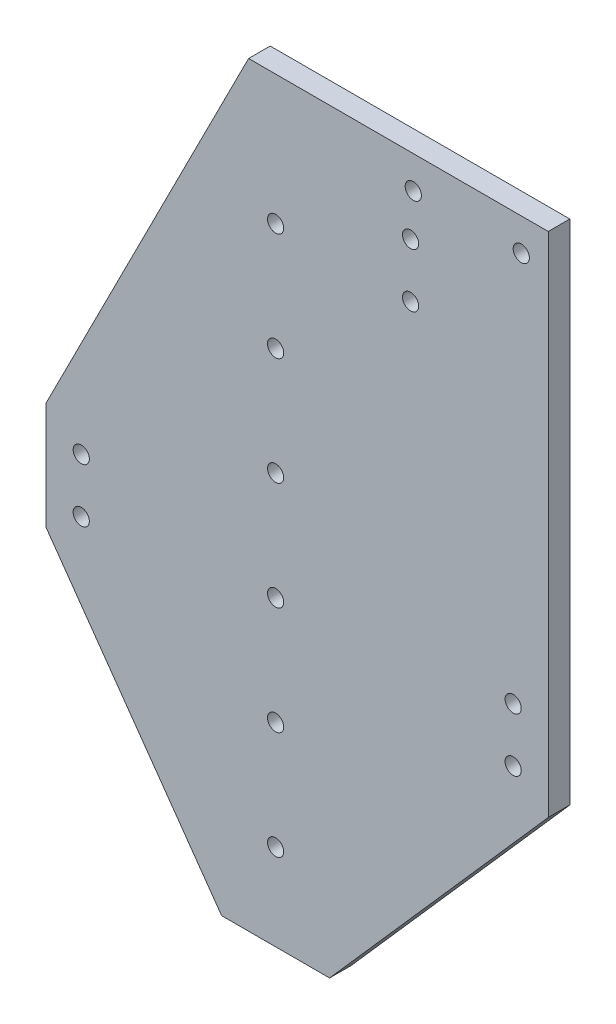
ISO-10303-21;
HEADER;
FILE_DESCRIPTION(('STEP AP214'),'2;1');
FILE_NAME('part.step','',(''),(''),'','','');
FILE_SCHEMA(('AUTOMOTIVE_DESIGN { 1 0 10303 214 1 1 1 1 }'));
ENDSEC;
DATA;
#1=APPLICATION_CONTEXT('core data for automotive mechanical design processes');
#2=APPLICATION_PROTOCOL_DEFINITION('international standard','automotive_design',2000,#1);
#3=PRODUCT_CONTEXT('',#1,'mechanical');
#4=PRODUCT('Part','Part','',(#3));
#5=PRODUCT_RELATED_PRODUCT_CATEGORY('part','',(#4));
#6=PRODUCT_DEFINITION_FORMATION('','',#4);
#7=PRODUCT_DEFINITION_CONTEXT('part definition',#1,'design');
#8=PRODUCT_DEFINITION('design','',#6,#7);
#9=PRODUCT_DEFINITION_SHAPE('','',#8);
#10=(LENGTH_UNIT() NAMED_UNIT(*) SI_UNIT(.MILLI.,.METRE.));
#11=(NAMED_UNIT(*) PLANE_ANGLE_UNIT() SI_UNIT($,.RADIAN.));
#12=(NAMED_UNIT(*) SI_UNIT($,.STERADIAN.) SOLID_ANGLE_UNIT());
#13=UNCERTAINTY_MEASURE_WITH_UNIT(LENGTH_MEASURE(1.E-05),#10,'distance_accuracy_value','');
#14=(GEOMETRIC_REPRESENTATION_CONTEXT(3) GLOBAL_UNCERTAINTY_ASSIGNED_CONTEXT((#13)) GLOBAL_UNIT_ASSIGNED_CONTEXT((#10,
#11,#12)) REPRESENTATION_CONTEXT('',''));
#15=CARTESIAN_POINT('',(0.,0.,0.));
#16=DIRECTION('',(0.,0.,1.));
#17=DIRECTION('',(1.,0.,0.));
#18=AXIS2_PLACEMENT_3D('',#15,#16,#17);
#19=CARTESIAN_POINT('',(0.,0.,4.));
#20=DIRECTION('',(0.,0.,-1.));
#21=DIRECTION('',(-1.,0.,0.));
#22=AXIS2_PLACEMENT_3D('',#19,#20,#21);
#23=PLANE('',#22);
#24=DIRECTION('',(0.660811783322883,0.750551655132164,0.));
#25=VECTOR('',#24,1.);
#26=CARTESIAN_POINT('',(-40.5,-46.,4.));
#27=LINE('',#26,#25);
#28=CARTESIAN_POINT('',(-40.5,-46.,4.));
#29=VERTEX_POINT('',#28);
#30=CARTESIAN_POINT('',(0.,0.,4.));
#31=VERTEX_POINT('',#30);
#32=EDGE_CURVE('E143',#29,#31,#27,.T.);
#33=ORIENTED_EDGE('',*,*,#32,.T.);
#34=DIRECTION('',(0.,1.,0.));
#35=VECTOR('',#34,1.);
#36=CARTESIAN_POINT('',(0.,0.,4.));
#37=LINE('',#36,#35);
#38=CARTESIAN_POINT('',(0.,94.,4.));
#39=VERTEX_POINT('',#38);
#40=EDGE_CURVE('E96',#31,#39,#37,.T.);
#41=ORIENTED_EDGE('',*,*,#40,.T.);
#42=DIRECTION('',(-1.,0.,0.));
#43=VECTOR('',#42,1.);
#44=CARTESIAN_POINT('',(-55.5,94.,4.));
#45=LINE('',#44,#43);
#46=CARTESIAN_POINT('',(-55.5,94.,4.));
#47=VERTEX_POINT('',#46);
#48=EDGE_CURVE('E157',#39,#47,#45,.T.);
#49=ORIENTED_EDGE('',*,*,#48,.T.);
#50=DIRECTION('',(-0.452028737244174,-0.892003374828502,0.));
#51=VECTOR('',#50,1.);
#52=CARTESIAN_POINT('',(-93.,20.,4.));
#53=LINE('',#52,#51);
#54=CARTESIAN_POINT('',(-93.,20.,4.));
#55=VERTEX_POINT('',#54);
#56=EDGE_CURVE('E112',#47,#55,#53,.T.);
#57=ORIENTED_EDGE('',*,*,#56,.T.);
#58=DIRECTION('',(0.,-1.,0.));
#59=VECTOR('',#58,1.);
#60=CARTESIAN_POINT('',(-93.,0.,4.));
#61=LINE('',#60,#59);
#62=CARTESIAN_POINT('',(-93.,0.,4.));
#63=VERTEX_POINT('',#62);
#64=EDGE_CURVE('E108',#55,#63,#61,.T.);
#65=ORIENTED_EDGE('',*,*,#64,.T.);
#66=DIRECTION('',(0.577031680864998,-0.816721763685844,0.));
#67=VECTOR('',#66,1.);
#68=CARTESIAN_POINT('',(-93.,0.,4.));
#69=LINE('',#68,#67);
#70=CARTESIAN_POINT('',(-60.5,-46.,4.));
#71=VERTEX_POINT('',#70);
#72=EDGE_CURVE('E115',#63,#71,#69,.T.);
#73=ORIENTED_EDGE('',*,*,#72,.T.);
#74=DIRECTION('',(1.,0.,0.));
#75=VECTOR('',#74,1.);
#76=CARTESIAN_POINT('',(-60.5,-46.,4.));
#77=LINE('',#76,#75);
#78=EDGE_CURVE('E59',#71,#29,#77,.T.);
#79=ORIENTED_EDGE('',*,*,#78,.T.);
#80=EDGE_LOOP('',(#33,#41,#49,#57,#65,#73,#79));
#81=FACE_BOUND('',#80,.T.);
#82=CARTESIAN_POINT('',(-86.5,15.,4.));
#83=DIRECTION('',(0.,0.,1.));
#84=DIRECTION('',(1.,0.,0.));
#85=AXIS2_PLACEMENT_3D('',#82,#83,#84);
#86=CIRCLE('',#85,1.5);
#87=CARTESIAN_POINT('',(-85.,15.,4.));
#88=VERTEX_POINT('',#87);
#89=EDGE_CURVE('E136',#88,#88,#86,.T.);
#90=ORIENTED_EDGE('',*,*,#89,.F.);
#91=EDGE_LOOP('',(#90));
#92=FACE_BOUND('',#91,.T.);
#93=CARTESIAN_POINT('',(-86.5,5.00000000000003,4.));
#94=DIRECTION('',(0.,0.,1.));
#95=DIRECTION('',(-1.,0.,0.));
#96=AXIS2_PLACEMENT_3D('',#93,#94,#95);
#97=CIRCLE('',#96,1.5);
#98=CARTESIAN_POINT('',(-88.,5.00000000000003,4.));
#99=VERTEX_POINT('',#98);
#100=EDGE_CURVE('E175',#99,#99,#97,.T.);
#101=ORIENTED_EDGE('',*,*,#100,.F.);
#102=EDGE_LOOP('',(#101));
#103=FACE_BOUND('',#102,.T.);
#104=CARTESIAN_POINT('',(-6.50000000000001,5.00000000000003,4.));
#105=DIRECTION('',(0.,0.,1.));
#106=DIRECTION('',(1.,0.,0.));
#107=AXIS2_PLACEMENT_3D('',#104,#105,#106);
#108=CIRCLE('',#107,1.5);
#109=CARTESIAN_POINT('',(-5.,5.00000000000003,4.));
#110=VERTEX_POINT('',#109);
#111=EDGE_CURVE('E178',#110,#110,#108,.T.);
#112=ORIENTED_EDGE('',*,*,#111,.F.);
#113=EDGE_LOOP('',(#112));
#114=FACE_BOUND('',#113,.T.);
#115=CARTESIAN_POINT('',(-6.50000000000001,15.,4.));
#116=DIRECTION('',(0.,0.,1.));
#117=DIRECTION('',(-1.,0.,0.));
#118=AXIS2_PLACEMENT_3D('',#115,#116,#117);
#119=CIRCLE('',#118,1.5);
#120=CARTESIAN_POINT('',(-8.00000000000001,15.,4.));
#121=VERTEX_POINT('',#120);
#122=EDGE_CURVE('E183',#121,#121,#119,.T.);
#123=ORIENTED_EDGE('',*,*,#122,.F.);
#124=EDGE_LOOP('',(#123));
#125=FACE_BOUND('',#124,.T.);
#126=CARTESIAN_POINT('',(-25.5,80.,4.));
#127=DIRECTION('',(0.,0.,1.));
#128=DIRECTION('',(1.,0.,0.));
#129=AXIS2_PLACEMENT_3D('',#126,#127,#128);
#130=CIRCLE('',#129,1.5);
#131=CARTESIAN_POINT('',(-24.,80.,4.));
#132=VERTEX_POINT('',#131);
#133=EDGE_CURVE('E188',#132,#132,#130,.T.);
#134=ORIENTED_EDGE('',*,*,#133,.F.);
#135=EDGE_LOOP('',(#134));
#136=FACE_BOUND('',#135,.T.);
#137=CARTESIAN_POINT('',(-25.4999999999999,70.,4.));
#138=DIRECTION('',(0.,0.,1.));
#139=DIRECTION('',(1.,0.,0.));
#140=AXIS2_PLACEMENT_3D('',#137,#138,#139);
#141=CIRCLE('',#140,1.5);
#142=CARTESIAN_POINT('',(-23.9999999999999,70.,4.));
#143=VERTEX_POINT('',#142);
#144=EDGE_CURVE('E197',#143,#143,#141,.T.);
#145=ORIENTED_EDGE('',*,*,#144,.F.);
#146=EDGE_LOOP('',(#145));
#147=FACE_BOUND('',#146,.T.);
#148=CARTESIAN_POINT('',(-50.5,10.,4.));
#149=DIRECTION('',(0.,0.,1.));
#150=DIRECTION('',(1.,0.,0.));
#151=AXIS2_PLACEMENT_3D('',#148,#149,#150);
#152=CIRCLE('',#151,1.5);
#153=CARTESIAN_POINT('',(-49.,10.,4.));
#154=VERTEX_POINT('',#153);
#155=EDGE_CURVE('E202',#154,#154,#152,.T.);
#156=ORIENTED_EDGE('',*,*,#155,.F.);
#157=EDGE_LOOP('',(#156));
#158=FACE_BOUND('',#157,.T.);
#159=CARTESIAN_POINT('',(-50.5000000000001,30.,4.));
#160=DIRECTION('',(0.,0.,1.));
#161=DIRECTION('',(1.,0.,0.));
#162=AXIS2_PLACEMENT_3D('',#159,#160,#161);
#163=CIRCLE('',#162,1.5);
#164=CARTESIAN_POINT('',(-49.0000000000001,30.,4.));
#165=VERTEX_POINT('',#164);
#166=EDGE_CURVE('E206',#165,#165,#163,.T.);
#167=ORIENTED_EDGE('',*,*,#166,.F.);
#168=EDGE_LOOP('',(#167));
#169=FACE_BOUND('',#168,.T.);
#170=CARTESIAN_POINT('',(-50.5000000000001,50.,4.));
#171=DIRECTION('',(0.,0.,1.));
#172=DIRECTION('',(1.,0.,0.));
#173=AXIS2_PLACEMENT_3D('',#170,#171,#172);
#174=CIRCLE('',#173,1.5);
#175=CARTESIAN_POINT('',(-49.0000000000001,50.,4.));
#176=VERTEX_POINT('',#175);
#177=EDGE_CURVE('E211',#176,#176,#174,.T.);
#178=ORIENTED_EDGE('',*,*,#177,.F.);
#179=EDGE_LOOP('',(#178));
#180=FACE_BOUND('',#179,.T.);
#181=CARTESIAN_POINT('',(-50.4999999999998,-10.,4.));
#182=DIRECTION('',(0.,0.,1.));
#183=DIRECTION('',(1.,0.,0.));
#184=AXIS2_PLACEMENT_3D('',#181,#182,#183);
#185=CIRCLE('',#184,1.5);
#186=CARTESIAN_POINT('',(-48.9999999999998,-10.,4.));
#187=VERTEX_POINT('',#186);
#188=EDGE_CURVE('E218',#187,#187,#185,.T.);
#189=ORIENTED_EDGE('',*,*,#188,.F.);
#190=EDGE_LOOP('',(#189));
#191=FACE_BOUND('',#190,.T.);
#192=CARTESIAN_POINT('',(-50.4999999999996,-30.,4.));
#193=DIRECTION('',(0.,0.,1.));
#194=DIRECTION('',(1.,0.,0.));
#195=AXIS2_PLACEMENT_3D('',#192,#193,#194);
#196=CIRCLE('',#195,1.5);
#197=CARTESIAN_POINT('',(-48.9999999999996,-30.,4.));
#198=VERTEX_POINT('',#197);
#199=EDGE_CURVE('E228',#198,#198,#196,.T.);
#200=ORIENTED_EDGE('',*,*,#199,.F.);
#201=EDGE_LOOP('',(#200));
#202=FACE_BOUND('',#201,.T.);
#203=CARTESIAN_POINT('',(-5.,88.,4.));
#204=DIRECTION('',(0.,0.,1.));
#205=DIRECTION('',(1.,0.,0.));
#206=AXIS2_PLACEMENT_3D('',#203,#204,#205);
#207=CIRCLE('',#206,1.5);
#208=CARTESIAN_POINT('',(-3.5,88.,4.));
#209=VERTEX_POINT('',#208);
#210=EDGE_CURVE('E235',#209,#209,#207,.T.);
#211=ORIENTED_EDGE('',*,*,#210,.F.);
#212=EDGE_LOOP('',(#211));
#213=FACE_BOUND('',#212,.T.);
#214=CARTESIAN_POINT('',(-25.,88.,4.));
#215=DIRECTION('',(0.,0.,1.));
#216=DIRECTION('',(1.,0.,0.));
#217=AXIS2_PLACEMENT_3D('',#214,#215,#216);
#218=CIRCLE('',#217,1.5);
#219=CARTESIAN_POINT('',(-23.5,88.,4.));
#220=VERTEX_POINT('',#219);
#221=EDGE_CURVE('E238',#220,#220,#218,.T.);
#222=ORIENTED_EDGE('',*,*,#221,.F.);
#223=EDGE_LOOP('',(#222));
#224=FACE_BOUND('',#223,.T.);
#225=CARTESIAN_POINT('',(-50.5000000000002,70.,4.));
#226=DIRECTION('',(0.,0.,1.));
#227=DIRECTION('',(1.,0.,0.));
#228=AXIS2_PLACEMENT_3D('',#225,#226,#227);
#229=CIRCLE('',#228,1.49999999999999);
#230=CARTESIAN_POINT('',(-49.0000000000002,70.,4.));
#231=VERTEX_POINT('',#230);
#232=EDGE_CURVE('E242',#231,#231,#229,.T.);
#233=ORIENTED_EDGE('',*,*,#232,.F.);
#234=EDGE_LOOP('',(#233));
#235=FACE_BOUND('',#234,.T.);
#236=ADVANCED_FACE('F41',(#81,#92,#103,#114,#125,#136,#147,#158,#169,#180,#191,#202,#213,#224,
#235),#23,.F.);
#237=CARTESIAN_POINT('',(0.,0.,0.));
#238=DIRECTION('',(0.,0.,-1.));
#239=DIRECTION('',(-1.,0.,0.));
#240=AXIS2_PLACEMENT_3D('',#237,#238,#239);
#241=PLANE('',#240);
#242=CARTESIAN_POINT('',(-25.,88.,0.));
#243=DIRECTION('',(0.,0.,1.));
#244=DIRECTION('',(1.,0.,0.));
#245=AXIS2_PLACEMENT_3D('',#242,#243,#244);
#246=CIRCLE('',#245,1.5);
#247=CARTESIAN_POINT('',(-23.5,88.,0.));
#248=VERTEX_POINT('',#247);
#249=EDGE_CURVE('E241',#248,#248,#246,.T.);
#250=ORIENTED_EDGE('',*,*,#249,.T.);
#251=EDGE_LOOP('',(#250));
#252=FACE_BOUND('',#251,.T.);
#253=CARTESIAN_POINT('',(-50.4999999999996,-30.,0.));
#254=DIRECTION('',(0.,0.,1.));
#255=DIRECTION('',(1.,0.,0.));
#256=AXIS2_PLACEMENT_3D('',#253,#254,#255);
#257=CIRCLE('',#256,1.5);
#258=CARTESIAN_POINT('',(-48.9999999999996,-30.,0.));
#259=VERTEX_POINT('',#258);
#260=EDGE_CURVE('E230',#259,#259,#257,.T.);
#261=ORIENTED_EDGE('',*,*,#260,.T.);
#262=EDGE_LOOP('',(#261));
#263=FACE_BOUND('',#262,.T.);
#264=CARTESIAN_POINT('',(-50.5000000000001,50.,0.));
#265=DIRECTION('',(0.,0.,1.));
#266=DIRECTION('',(1.,0.,0.));
#267=AXIS2_PLACEMENT_3D('',#264,#265,#266);
#268=CIRCLE('',#267,1.5);
#269=CARTESIAN_POINT('',(-49.0000000000001,50.,0.));
#270=VERTEX_POINT('',#269);
#271=EDGE_CURVE('E220',#270,#270,#268,.T.);
#272=ORIENTED_EDGE('',*,*,#271,.T.);
#273=EDGE_LOOP('',(#272));
#274=FACE_BOUND('',#273,.T.);
#275=CARTESIAN_POINT('',(-50.5,10.,0.));
#276=DIRECTION('',(0.,0.,1.));
#277=DIRECTION('',(1.,0.,0.));
#278=AXIS2_PLACEMENT_3D('',#275,#276,#277);
#279=CIRCLE('',#278,1.5);
#280=CARTESIAN_POINT('',(-49.,10.,0.));
#281=VERTEX_POINT('',#280);
#282=EDGE_CURVE('E205',#281,#281,#279,.T.);
#283=ORIENTED_EDGE('',*,*,#282,.T.);
#284=EDGE_LOOP('',(#283));
#285=FACE_BOUND('',#284,.T.);
#286=CARTESIAN_POINT('',(-25.5,80.,0.));
#287=DIRECTION('',(0.,0.,1.));
#288=DIRECTION('',(1.,0.,0.));
#289=AXIS2_PLACEMENT_3D('',#286,#287,#288);
#290=CIRCLE('',#289,1.5);
#291=CARTESIAN_POINT('',(-24.,80.,0.));
#292=VERTEX_POINT('',#291);
#293=EDGE_CURVE('E194',#292,#292,#290,.T.);
#294=ORIENTED_EDGE('',*,*,#293,.T.);
#295=EDGE_LOOP('',(#294));
#296=FACE_BOUND('',#295,.T.);
#297=CARTESIAN_POINT('',(-6.50000000000001,5.00000000000003,0.));
#298=DIRECTION('',(0.,0.,1.));
#299=DIRECTION('',(1.,0.,0.));
#300=AXIS2_PLACEMENT_3D('',#297,#298,#299);
#301=CIRCLE('',#300,1.5);
#302=CARTESIAN_POINT('',(-5.,5.00000000000003,0.));
#303=VERTEX_POINT('',#302);
#304=EDGE_CURVE('E181',#303,#303,#301,.T.);
#305=ORIENTED_EDGE('',*,*,#304,.T.);
#306=EDGE_LOOP('',(#305));
#307=FACE_BOUND('',#306,.T.);
#308=CARTESIAN_POINT('',(-86.5,15.,0.));
#309=DIRECTION('',(0.,0.,1.));
#310=DIRECTION('',(1.,0.,0.));
#311=AXIS2_PLACEMENT_3D('',#308,#309,#310);
#312=CIRCLE('',#311,1.5);
#313=CARTESIAN_POINT('',(-85.,15.,0.));
#314=VERTEX_POINT('',#313);
#315=EDGE_CURVE('E169',#314,#314,#312,.T.);
#316=ORIENTED_EDGE('',*,*,#315,.T.);
#317=EDGE_LOOP('',(#316));
#318=FACE_BOUND('',#317,.T.);
#319=DIRECTION('',(0.660811783322883,0.750551655132164,0.));
#320=VECTOR('',#319,1.);
#321=CARTESIAN_POINT('',(-40.5,-46.,0.));
#322=LINE('',#321,#320);
#323=CARTESIAN_POINT('',(-40.5,-46.,0.));
#324=VERTEX_POINT('',#323);
#325=CARTESIAN_POINT('',(0.,0.,0.));
#326=VERTEX_POINT('',#325);
#327=EDGE_CURVE('E135',#324,#326,#322,.T.);
#328=ORIENTED_EDGE('',*,*,#327,.F.);
#329=DIRECTION('',(1.,0.,0.));
#330=VECTOR('',#329,1.);
#331=CARTESIAN_POINT('',(-60.5,-46.,0.));
#332=LINE('',#331,#330);
#333=CARTESIAN_POINT('',(-60.5,-46.,0.));
#334=VERTEX_POINT('',#333);
#335=EDGE_CURVE('E88',#334,#324,#332,.T.);
#336=ORIENTED_EDGE('',*,*,#335,.F.);
#337=DIRECTION('',(0.577031680864998,-0.816721763685844,0.));
#338=VECTOR('',#337,1.);
#339=CARTESIAN_POINT('',(-93.,0.,0.));
#340=LINE('',#339,#338);
#341=CARTESIAN_POINT('',(-93.,0.,0.));
#342=VERTEX_POINT('',#341);
#343=EDGE_CURVE('E81',#342,#334,#340,.T.);
#344=ORIENTED_EDGE('',*,*,#343,.F.);
#345=DIRECTION('',(0.,-1.,0.));
#346=VECTOR('',#345,1.);
#347=CARTESIAN_POINT('',(-93.,0.,0.));
#348=LINE('',#347,#346);
#349=CARTESIAN_POINT('',(-93.,20.,0.));
#350=VERTEX_POINT('',#349);
#351=EDGE_CURVE('E125',#350,#342,#348,.T.);
#352=ORIENTED_EDGE('',*,*,#351,.F.);
#353=DIRECTION('',(-0.452028737244174,-0.892003374828502,0.));
#354=VECTOR('',#353,1.);
#355=CARTESIAN_POINT('',(-93.,20.,0.));
#356=LINE('',#355,#354);
#357=CARTESIAN_POINT('',(-55.5,94.,0.));
#358=VERTEX_POINT('',#357);
#359=EDGE_CURVE('E140',#358,#350,#356,.T.);
#360=ORIENTED_EDGE('',*,*,#359,.F.);
#361=DIRECTION('',(-1.,0.,0.));
#362=VECTOR('',#361,1.);
#363=CARTESIAN_POINT('',(-55.5,94.,0.));
#364=LINE('',#363,#362);
#365=CARTESIAN_POINT('',(0.,94.,0.));
#366=VERTEX_POINT('',#365);
#367=EDGE_CURVE('E139',#366,#358,#364,.T.);
#368=ORIENTED_EDGE('',*,*,#367,.F.);
#369=DIRECTION('',(0.,1.,0.));
#370=VECTOR('',#369,1.);
#371=CARTESIAN_POINT('',(0.,0.,0.));
#372=LINE('',#371,#370);
#373=EDGE_CURVE('E133',#326,#366,#372,.T.);
#374=ORIENTED_EDGE('',*,*,#373,.F.);
#375=EDGE_LOOP('',(#328,#336,#344,#352,#360,#368,#374));
#376=FACE_BOUND('',#375,.T.);
#377=CARTESIAN_POINT('',(-86.5,5.00000000000003,0.));
#378=DIRECTION('',(0.,0.,1.));
#379=DIRECTION('',(-1.,0.,0.));
#380=AXIS2_PLACEMENT_3D('',#377,#378,#379);
#381=CIRCLE('',#380,1.5);
#382=CARTESIAN_POINT('',(-88.,5.00000000000003,0.));
#383=VERTEX_POINT('',#382);
#384=EDGE_CURVE('E174',#383,#383,#381,.T.);
#385=ORIENTED_EDGE('',*,*,#384,.T.);
#386=EDGE_LOOP('',(#385));
#387=FACE_BOUND('',#386,.T.);
#388=CARTESIAN_POINT('',(-6.50000000000001,15.,0.));
#389=DIRECTION('',(0.,0.,1.));
#390=DIRECTION('',(-1.,0.,0.));
#391=AXIS2_PLACEMENT_3D('',#388,#389,#390);
#392=CIRCLE('',#391,1.5);
#393=CARTESIAN_POINT('',(-8.00000000000001,15.,0.));
#394=VERTEX_POINT('',#393);
#395=EDGE_CURVE('E190',#394,#394,#392,.T.);
#396=ORIENTED_EDGE('',*,*,#395,.T.);
#397=EDGE_LOOP('',(#396));
#398=FACE_BOUND('',#397,.T.);
#399=CARTESIAN_POINT('',(-25.4999999999999,70.,0.));
#400=DIRECTION('',(0.,0.,1.));
#401=DIRECTION('',(1.,0.,0.));
#402=AXIS2_PLACEMENT_3D('',#399,#400,#401);
#403=CIRCLE('',#402,1.5);
#404=CARTESIAN_POINT('',(-23.9999999999999,70.,0.));
#405=VERTEX_POINT('',#404);
#406=EDGE_CURVE('E196',#405,#405,#403,.T.);
#407=ORIENTED_EDGE('',*,*,#406,.T.);
#408=EDGE_LOOP('',(#407));
#409=FACE_BOUND('',#408,.T.);
#410=CARTESIAN_POINT('',(-50.5000000000001,30.,0.));
#411=DIRECTION('',(0.,0.,1.));
#412=DIRECTION('',(1.,0.,0.));
#413=AXIS2_PLACEMENT_3D('',#410,#411,#412);
#414=CIRCLE('',#413,1.5);
#415=CARTESIAN_POINT('',(-49.0000000000001,30.,0.));
#416=VERTEX_POINT('',#415);
#417=EDGE_CURVE('E212',#416,#416,#414,.T.);
#418=ORIENTED_EDGE('',*,*,#417,.T.);
#419=EDGE_LOOP('',(#418));
#420=FACE_BOUND('',#419,.T.);
#421=CARTESIAN_POINT('',(-50.4999999999998,-10.,0.));
#422=DIRECTION('',(0.,0.,1.));
#423=DIRECTION('',(1.,0.,0.));
#424=AXIS2_PLACEMENT_3D('',#421,#422,#423);
#425=CIRCLE('',#424,1.5);
#426=CARTESIAN_POINT('',(-48.9999999999998,-10.,0.));
#427=VERTEX_POINT('',#426);
#428=EDGE_CURVE('E224',#427,#427,#425,.T.);
#429=ORIENTED_EDGE('',*,*,#428,.T.);
#430=EDGE_LOOP('',(#429));
#431=FACE_BOUND('',#430,.T.);
#432=CARTESIAN_POINT('',(-5.,88.,0.));
#433=DIRECTION('',(0.,0.,1.));
#434=DIRECTION('',(1.,0.,0.));
#435=AXIS2_PLACEMENT_3D('',#432,#433,#434);
#436=CIRCLE('',#435,1.5);
#437=CARTESIAN_POINT('',(-3.5,88.,0.));
#438=VERTEX_POINT('',#437);
#439=EDGE_CURVE('E232',#438,#438,#436,.T.);
#440=ORIENTED_EDGE('',*,*,#439,.T.);
#441=EDGE_LOOP('',(#440));
#442=FACE_BOUND('',#441,.T.);
#443=CARTESIAN_POINT('',(-50.5000000000002,70.,0.));
#444=DIRECTION('',(0.,0.,1.));
#445=DIRECTION('',(1.,0.,0.));
#446=AXIS2_PLACEMENT_3D('',#443,#444,#445);
#447=CIRCLE('',#446,1.49999999999999);
#448=CARTESIAN_POINT('',(-49.0000000000002,70.,0.));
#449=VERTEX_POINT('',#448);
#450=EDGE_CURVE('E250',#449,#449,#447,.T.);
#451=ORIENTED_EDGE('',*,*,#450,.T.);
#452=EDGE_LOOP('',(#451));
#453=FACE_BOUND('',#452,.T.);
#454=ADVANCED_FACE('F163',(#252,#263,#274,#285,#296,#307,#318,#376,#387,#398,#409,#420,#431,
#442,#453),#241,.T.);
#455=CARTESIAN_POINT('',(-40.5,-46.,4.));
#456=DIRECTION('',(-0.750551655132164,0.660811783322883,0.));
#457=DIRECTION('',(-0.660811783322883,-0.750551655132164,0.));
#458=AXIS2_PLACEMENT_3D('',#455,#456,#457);
#459=PLANE('',#458);
#460=ORIENTED_EDGE('',*,*,#327,.T.);
#461=DIRECTION('',(0.,0.,-1.));
#462=VECTOR('',#461,1.);
#463=CARTESIAN_POINT('',(0.,0.,4.));
#464=LINE('',#463,#462);
#465=EDGE_CURVE('E11',#31,#326,#464,.T.);
#466=ORIENTED_EDGE('',*,*,#465,.F.);
#467=ORIENTED_EDGE('',*,*,#32,.F.);
#468=DIRECTION('',(0.,0.,-1.));
#469=VECTOR('',#468,1.);
#470=CARTESIAN_POINT('',(-40.5,-46.,4.));
#471=LINE('',#470,#469);
#472=EDGE_CURVE('E129',#29,#324,#471,.T.);
#473=ORIENTED_EDGE('',*,*,#472,.T.);
#474=EDGE_LOOP('',(#460,#466,#467,#473));
#475=FACE_BOUND('',#474,.T.);
#476=ADVANCED_FACE('F43',(#475),#459,.F.);
#477=CARTESIAN_POINT('',(0.,0.,4.));
#478=DIRECTION('',(-1.,0.,0.));
#479=DIRECTION('',(0.,0.,1.));
#480=AXIS2_PLACEMENT_3D('',#477,#478,#479);
#481=PLANE('',#480);
#482=ORIENTED_EDGE('',*,*,#373,.T.);
#483=DIRECTION('',(0.,0.,-1.));
#484=VECTOR('',#483,1.);
#485=CARTESIAN_POINT('',(0.,94.,4.));
#486=LINE('',#485,#484);
#487=EDGE_CURVE('E49',#39,#366,#486,.T.);
#488=ORIENTED_EDGE('',*,*,#487,.F.);
#489=ORIENTED_EDGE('',*,*,#40,.F.);
#490=ORIENTED_EDGE('',*,*,#465,.T.);
#491=EDGE_LOOP('',(#482,#488,#489,#490));
#492=FACE_BOUND('',#491,.T.);
#493=ADVANCED_FACE('F280',(#492),#481,.F.);
#494=CARTESIAN_POINT('',(-55.5,94.,4.));
#495=DIRECTION('',(0.,-1.,0.));
#496=DIRECTION('',(0.,0.,-1.));
#497=AXIS2_PLACEMENT_3D('',#494,#495,#496);
#498=PLANE('',#497);
#499=ORIENTED_EDGE('',*,*,#367,.T.);
#500=DIRECTION('',(0.,0.,-1.));
#501=VECTOR('',#500,1.);
#502=CARTESIAN_POINT('',(-55.5,94.,4.));
#503=LINE('',#502,#501);
#504=EDGE_CURVE('E146',#47,#358,#503,.T.);
#505=ORIENTED_EDGE('',*,*,#504,.F.);
#506=ORIENTED_EDGE('',*,*,#48,.F.);
#507=ORIENTED_EDGE('',*,*,#487,.T.);
#508=EDGE_LOOP('',(#499,#505,#506,#507));
#509=FACE_BOUND('',#508,.T.);
#510=ADVANCED_FACE('F153',(#509),#498,.F.);
#511=CARTESIAN_POINT('',(-93.,20.,4.));
#512=DIRECTION('',(0.892003374828502,-0.452028737244174,0.));
#513=DIRECTION('',(0.452028737244174,0.892003374828503,0.));
#514=AXIS2_PLACEMENT_3D('',#511,#512,#513);
#515=PLANE('',#514);
#516=ORIENTED_EDGE('',*,*,#359,.T.);
#517=DIRECTION('',(0.,0.,-1.));
#518=VECTOR('',#517,1.);
#519=CARTESIAN_POINT('',(-93.,20.,4.));
#520=LINE('',#519,#518);
#521=EDGE_CURVE('E124',#55,#350,#520,.T.);
#522=ORIENTED_EDGE('',*,*,#521,.F.);
#523=ORIENTED_EDGE('',*,*,#56,.F.);
#524=ORIENTED_EDGE('',*,*,#504,.T.);
#525=EDGE_LOOP('',(#516,#522,#523,#524));
#526=FACE_BOUND('',#525,.T.);
#527=ADVANCED_FACE('F165',(#526),#515,.F.);
#528=CARTESIAN_POINT('',(-93.,0.,4.));
#529=DIRECTION('',(1.,0.,0.));
#530=DIRECTION('',(0.,0.,-1.));
#531=AXIS2_PLACEMENT_3D('',#528,#529,#530);
#532=PLANE('',#531);
#533=ORIENTED_EDGE('',*,*,#351,.T.);
#534=DIRECTION('',(0.,0.,-1.));
#535=VECTOR('',#534,1.);
#536=CARTESIAN_POINT('',(-93.,0.,4.));
#537=LINE('',#536,#535);
#538=EDGE_CURVE('E118',#63,#342,#537,.T.);
#539=ORIENTED_EDGE('',*,*,#538,.F.);
#540=ORIENTED_EDGE('',*,*,#64,.F.);
#541=ORIENTED_EDGE('',*,*,#521,.T.);
#542=EDGE_LOOP('',(#533,#539,#540,#541));
#543=FACE_BOUND('',#542,.T.);
#544=ADVANCED_FACE('F119',(#543),#532,.F.);
#545=CARTESIAN_POINT('',(-93.,0.,4.));
#546=DIRECTION('',(0.816721763685844,0.577031680864998,0.));
#547=DIRECTION('',(-0.577031680864998,0.816721763685844,0.));
#548=AXIS2_PLACEMENT_3D('',#545,#546,#547);
#549=PLANE('',#548);
#550=ORIENTED_EDGE('',*,*,#343,.T.);
#551=DIRECTION('',(0.,0.,-1.));
#552=VECTOR('',#551,1.);
#553=CARTESIAN_POINT('',(-60.5,-46.,4.));
#554=LINE('',#553,#552);
#555=EDGE_CURVE('E121',#71,#334,#554,.T.);
#556=ORIENTED_EDGE('',*,*,#555,.F.);
#557=ORIENTED_EDGE('',*,*,#72,.F.);
#558=ORIENTED_EDGE('',*,*,#538,.T.);
#559=EDGE_LOOP('',(#550,#556,#557,#558));
#560=FACE_BOUND('',#559,.T.);
#561=ADVANCED_FACE('F127',(#560),#549,.F.);
#562=CARTESIAN_POINT('',(-60.5,-46.,4.));
#563=DIRECTION('',(0.,1.,0.));
#564=DIRECTION('',(0.,0.,1.));
#565=AXIS2_PLACEMENT_3D('',#562,#563,#564);
#566=PLANE('',#565);
#567=ORIENTED_EDGE('',*,*,#335,.T.);
#568=ORIENTED_EDGE('',*,*,#472,.F.);
#569=ORIENTED_EDGE('',*,*,#78,.F.);
#570=ORIENTED_EDGE('',*,*,#555,.T.);
#571=EDGE_LOOP('',(#567,#568,#569,#570));
#572=FACE_BOUND('',#571,.T.);
#573=ADVANCED_FACE('F267',(#572),#566,.F.);
#574=CARTESIAN_POINT('',(-86.5,15.,4.));
#575=DIRECTION('',(0.,0.,-1.));
#576=DIRECTION('',(-1.,0.,0.));
#577=AXIS2_PLACEMENT_3D('',#574,#575,#576);
#578=CYLINDRICAL_SURFACE('',#577,1.5);
#579=ORIENTED_EDGE('',*,*,#89,.T.);
#580=EDGE_LOOP('',(#579));
#581=FACE_BOUND('',#580,.T.);
#582=ORIENTED_EDGE('',*,*,#315,.F.);
#583=EDGE_LOOP('',(#582));
#584=FACE_BOUND('',#583,.T.);
#585=ADVANCED_FACE('F261',(#581,#584),#578,.F.);
#586=CARTESIAN_POINT('',(-86.5,5.00000000000003,4.));
#587=DIRECTION('',(0.,0.,-1.));
#588=DIRECTION('',(-1.,0.,0.));
#589=AXIS2_PLACEMENT_3D('',#586,#587,#588);
#590=CYLINDRICAL_SURFACE('',#589,1.5);
#591=ORIENTED_EDGE('',*,*,#100,.T.);
#592=EDGE_LOOP('',(#591));
#593=FACE_BOUND('',#592,.T.);
#594=ORIENTED_EDGE('',*,*,#384,.F.);
#595=EDGE_LOOP('',(#594));
#596=FACE_BOUND('',#595,.T.);
#597=ADVANCED_FACE('F335',(#593,#596),#590,.F.);
#598=CARTESIAN_POINT('',(-6.50000000000001,5.00000000000003,4.));
#599=DIRECTION('',(0.,0.,-1.));
#600=DIRECTION('',(-1.,0.,0.));
#601=AXIS2_PLACEMENT_3D('',#598,#599,#600);
#602=CYLINDRICAL_SURFACE('',#601,1.5);
#603=ORIENTED_EDGE('',*,*,#111,.T.);
#604=EDGE_LOOP('',(#603));
#605=FACE_BOUND('',#604,.T.);
#606=ORIENTED_EDGE('',*,*,#304,.F.);
#607=EDGE_LOOP('',(#606));
#608=FACE_BOUND('',#607,.T.);
#609=ADVANCED_FACE('F344',(#605,#608),#602,.F.);
#610=CARTESIAN_POINT('',(-6.50000000000001,15.,4.));
#611=DIRECTION('',(0.,0.,-1.));
#612=DIRECTION('',(-1.,0.,0.));
#613=AXIS2_PLACEMENT_3D('',#610,#611,#612);
#614=CYLINDRICAL_SURFACE('',#613,1.5);
#615=ORIENTED_EDGE('',*,*,#122,.T.);
#616=EDGE_LOOP('',(#615));
#617=FACE_BOUND('',#616,.T.);
#618=ORIENTED_EDGE('',*,*,#395,.F.);
#619=EDGE_LOOP('',(#618));
#620=FACE_BOUND('',#619,.T.);
#621=ADVANCED_FACE('F351',(#617,#620),#614,.F.);
#622=CARTESIAN_POINT('',(-25.5,80.,4.));
#623=DIRECTION('',(0.,0.,-1.));
#624=DIRECTION('',(-1.,0.,0.));
#625=AXIS2_PLACEMENT_3D('',#622,#623,#624);
#626=CYLINDRICAL_SURFACE('',#625,1.5);
#627=ORIENTED_EDGE('',*,*,#133,.T.);
#628=EDGE_LOOP('',(#627));
#629=FACE_BOUND('',#628,.T.);
#630=ORIENTED_EDGE('',*,*,#293,.F.);
#631=EDGE_LOOP('',(#630));
#632=FACE_BOUND('',#631,.T.);
#633=ADVANCED_FACE('F359',(#629,#632),#626,.F.);
#634=CARTESIAN_POINT('',(-25.4999999999999,70.,4.));
#635=DIRECTION('',(0.,0.,-1.));
#636=DIRECTION('',(-1.,0.,0.));
#637=AXIS2_PLACEMENT_3D('',#634,#635,#636);
#638=CYLINDRICAL_SURFACE('',#637,1.5);
#639=ORIENTED_EDGE('',*,*,#144,.T.);
#640=EDGE_LOOP('',(#639));
#641=FACE_BOUND('',#640,.T.);
#642=ORIENTED_EDGE('',*,*,#406,.F.);
#643=EDGE_LOOP('',(#642));
#644=FACE_BOUND('',#643,.T.);
#645=ADVANCED_FACE('F367',(#641,#644),#638,.F.);
#646=CARTESIAN_POINT('',(-50.5,10.,4.));
#647=DIRECTION('',(0.,0.,-1.));
#648=DIRECTION('',(-1.,0.,0.));
#649=AXIS2_PLACEMENT_3D('',#646,#647,#648);
#650=CYLINDRICAL_SURFACE('',#649,1.5);
#651=ORIENTED_EDGE('',*,*,#155,.T.);
#652=EDGE_LOOP('',(#651));
#653=FACE_BOUND('',#652,.T.);
#654=ORIENTED_EDGE('',*,*,#282,.F.);
#655=EDGE_LOOP('',(#654));
#656=FACE_BOUND('',#655,.T.);
#657=ADVANCED_FACE('F377',(#653,#656),#650,.F.);
#658=CARTESIAN_POINT('',(-50.5000000000001,30.,4.));
#659=DIRECTION('',(0.,0.,-1.));
#660=DIRECTION('',(-1.,0.,0.));
#661=AXIS2_PLACEMENT_3D('',#658,#659,#660);
#662=CYLINDRICAL_SURFACE('',#661,1.5);
#663=ORIENTED_EDGE('',*,*,#166,.T.);
#664=EDGE_LOOP('',(#663));
#665=FACE_BOUND('',#664,.T.);
#666=ORIENTED_EDGE('',*,*,#417,.F.);
#667=EDGE_LOOP('',(#666));
#668=FACE_BOUND('',#667,.T.);
#669=ADVANCED_FACE('F390',(#665,#668),#662,.F.);
#670=CARTESIAN_POINT('',(-50.5000000000001,50.,4.));
#671=DIRECTION('',(0.,0.,-1.));
#672=DIRECTION('',(-1.,0.,0.));
#673=AXIS2_PLACEMENT_3D('',#670,#671,#672);
#674=CYLINDRICAL_SURFACE('',#673,1.5);
#675=ORIENTED_EDGE('',*,*,#177,.T.);
#676=EDGE_LOOP('',(#675));
#677=FACE_BOUND('',#676,.T.);
#678=ORIENTED_EDGE('',*,*,#271,.F.);
#679=EDGE_LOOP('',(#678));
#680=FACE_BOUND('',#679,.T.);
#681=ADVANCED_FACE('F396',(#677,#680),#674,.F.);
#682=CARTESIAN_POINT('',(-50.4999999999998,-10.,4.));
#683=DIRECTION('',(0.,0.,-1.));
#684=DIRECTION('',(-1.,0.,0.));
#685=AXIS2_PLACEMENT_3D('',#682,#683,#684);
#686=CYLINDRICAL_SURFACE('',#685,1.5);
#687=ORIENTED_EDGE('',*,*,#188,.T.);
#688=EDGE_LOOP('',(#687));
#689=FACE_BOUND('',#688,.T.);
#690=ORIENTED_EDGE('',*,*,#428,.F.);
#691=EDGE_LOOP('',(#690));
#692=FACE_BOUND('',#691,.T.);
#693=ADVANCED_FACE('F403',(#689,#692),#686,.F.);
#694=CARTESIAN_POINT('',(-50.4999999999996,-30.,4.));
#695=DIRECTION('',(0.,0.,-1.));
#696=DIRECTION('',(-1.,0.,0.));
#697=AXIS2_PLACEMENT_3D('',#694,#695,#696);
#698=CYLINDRICAL_SURFACE('',#697,1.5);
#699=ORIENTED_EDGE('',*,*,#199,.T.);
#700=EDGE_LOOP('',(#699));
#701=FACE_BOUND('',#700,.T.);
#702=ORIENTED_EDGE('',*,*,#260,.F.);
#703=EDGE_LOOP('',(#702));
#704=FACE_BOUND('',#703,.T.);
#705=ADVANCED_FACE('F411',(#701,#704),#698,.F.);
#706=CARTESIAN_POINT('',(-5.,88.,4.));
#707=DIRECTION('',(0.,0.,-1.));
#708=DIRECTION('',(-1.,0.,0.));
#709=AXIS2_PLACEMENT_3D('',#706,#707,#708);
#710=CYLINDRICAL_SURFACE('',#709,1.5);
#711=ORIENTED_EDGE('',*,*,#210,.T.);
#712=EDGE_LOOP('',(#711));
#713=FACE_BOUND('',#712,.T.);
#714=ORIENTED_EDGE('',*,*,#439,.F.);
#715=EDGE_LOOP('',(#714));
#716=FACE_BOUND('',#715,.T.);
#717=ADVANCED_FACE('F421',(#713,#716),#710,.F.);
#718=CARTESIAN_POINT('',(-25.,88.,4.));
#719=DIRECTION('',(0.,0.,-1.));
#720=DIRECTION('',(-1.,0.,0.));
#721=AXIS2_PLACEMENT_3D('',#718,#719,#720);
#722=CYLINDRICAL_SURFACE('',#721,1.5);
#723=ORIENTED_EDGE('',*,*,#221,.T.);
#724=EDGE_LOOP('',(#723));
#725=FACE_BOUND('',#724,.T.);
#726=ORIENTED_EDGE('',*,*,#249,.F.);
#727=EDGE_LOOP('',(#726));
#728=FACE_BOUND('',#727,.T.);
#729=ADVANCED_FACE('F435',(#725,#728),#722,.F.);
#730=CARTESIAN_POINT('',(-50.5000000000002,70.,4.));
#731=DIRECTION('',(0.,0.,-1.));
#732=DIRECTION('',(-1.,0.,0.));
#733=AXIS2_PLACEMENT_3D('',#730,#731,#732);
#734=CYLINDRICAL_SURFACE('',#733,1.49999999999999);
#735=ORIENTED_EDGE('',*,*,#232,.T.);
#736=EDGE_LOOP('',(#735));
#737=FACE_BOUND('',#736,.T.);
#738=ORIENTED_EDGE('',*,*,#450,.F.);
#739=EDGE_LOOP('',(#738));
#740=FACE_BOUND('',#739,.T.);
#741=ADVANCED_FACE('F254',(#737,#740),#734,.F.);
#742=CLOSED_SHELL('',(#236,#454,#476,#493,#510,#527,#544,#561,#573,#585,#597,#609,#621,#633,
#645,#657,#669,#681,#693,#705,#717,#729,#741));
#743=MANIFOLD_SOLID_BREP('B2',#742);
#744=ADVANCED_BREP_SHAPE_REPRESENTATION('',(#18,#743),#14);
#745=SHAPE_DEFINITION_REPRESENTATION(#9,#744);
ENDSEC;
END-ISO-10303-21;
